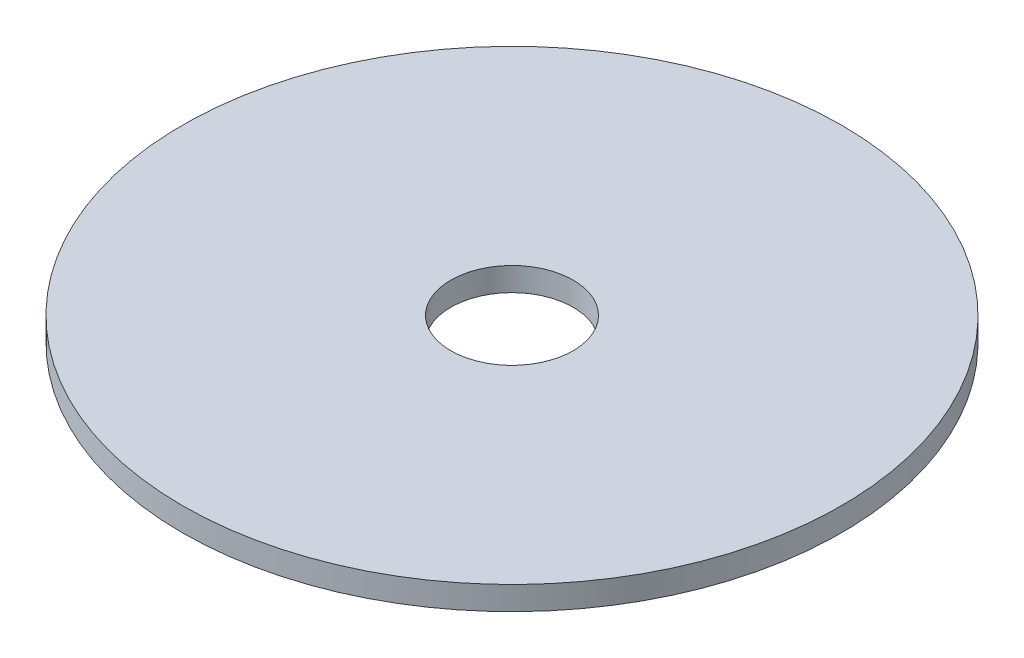
ISO-10303-21;
HEADER;
FILE_DESCRIPTION(('STEP AP214'),'2;1');
FILE_NAME('part.step','',(''),(''),'','','');
FILE_SCHEMA(('AUTOMOTIVE_DESIGN { 1 0 10303 214 1 1 1 1 }'));
ENDSEC;
DATA;
#1=APPLICATION_CONTEXT('core data for automotive mechanical design processes');
#2=APPLICATION_PROTOCOL_DEFINITION('international standard','automotive_design',2000,#1);
#3=PRODUCT_CONTEXT('',#1,'mechanical');
#4=PRODUCT('Part','Part','',(#3));
#5=PRODUCT_RELATED_PRODUCT_CATEGORY('part','',(#4));
#6=PRODUCT_DEFINITION_FORMATION('','',#4);
#7=PRODUCT_DEFINITION_CONTEXT('part definition',#1,'design');
#8=PRODUCT_DEFINITION('design','',#6,#7);
#9=PRODUCT_DEFINITION_SHAPE('','',#8);
#10=(LENGTH_UNIT() NAMED_UNIT(*) SI_UNIT(.MILLI.,.METRE.));
#11=(NAMED_UNIT(*) PLANE_ANGLE_UNIT() SI_UNIT($,.RADIAN.));
#12=(NAMED_UNIT(*) SI_UNIT($,.STERADIAN.) SOLID_ANGLE_UNIT());
#13=UNCERTAINTY_MEASURE_WITH_UNIT(LENGTH_MEASURE(1.E-05),#10,'distance_accuracy_value','');
#14=(GEOMETRIC_REPRESENTATION_CONTEXT(3) GLOBAL_UNCERTAINTY_ASSIGNED_CONTEXT((#13)) GLOBAL_UNIT_ASSIGNED_CONTEXT((#10,
#11,#12)) REPRESENTATION_CONTEXT('',''));
#15=CARTESIAN_POINT('',(0.,0.,0.));
#16=DIRECTION('',(0.,0.,1.));
#17=DIRECTION('',(1.,0.,0.));
#18=AXIS2_PLACEMENT_3D('',#15,#16,#17);
#19=CARTESIAN_POINT('',(0.,10.,0.));
#20=DIRECTION('',(0.,-1.,0.));
#21=DIRECTION('',(0.,0.,-1.));
#22=AXIS2_PLACEMENT_3D('',#19,#20,#21);
#23=CYLINDRICAL_SURFACE('',#22,140.);
#24=CARTESIAN_POINT('',(0.,10.,0.));
#25=DIRECTION('',(0.,1.,0.));
#26=DIRECTION('',(0.,0.,1.));
#27=AXIS2_PLACEMENT_3D('',#24,#25,#26);
#28=CIRCLE('',#27,140.);
#29=CARTESIAN_POINT('',(0.,10.,140.));
#30=VERTEX_POINT('',#29);
#31=EDGE_CURVE('E10',#30,#30,#28,.T.);
#32=ORIENTED_EDGE('',*,*,#31,.F.);
#33=EDGE_LOOP('',(#32));
#34=FACE_BOUND('',#33,.T.);
#35=CARTESIAN_POINT('',(0.,0.,0.));
#36=DIRECTION('',(0.,1.,0.));
#37=DIRECTION('',(0.,0.,1.));
#38=AXIS2_PLACEMENT_3D('',#35,#36,#37);
#39=CIRCLE('',#38,140.);
#40=CARTESIAN_POINT('',(0.,0.,140.));
#41=VERTEX_POINT('',#40);
#42=EDGE_CURVE('E35',#41,#41,#39,.T.);
#43=ORIENTED_EDGE('',*,*,#42,.T.);
#44=EDGE_LOOP('',(#43));
#45=FACE_BOUND('',#44,.T.);
#46=ADVANCED_FACE('F32',(#34,#45),#23,.T.);
#47=CARTESIAN_POINT('',(0.,10.,0.));
#48=DIRECTION('',(0.,1.,0.));
#49=DIRECTION('',(0.,0.,1.));
#50=AXIS2_PLACEMENT_3D('',#47,#48,#49);
#51=PLANE('',#50);
#52=CARTESIAN_POINT('',(0.,10.,0.));
#53=DIRECTION('',(0.,1.,0.));
#54=DIRECTION('',(0.,0.,1.));
#55=AXIS2_PLACEMENT_3D('',#52,#53,#54);
#56=CIRCLE('',#55,26.);
#57=CARTESIAN_POINT('',(0.,10.,26.));
#58=VERTEX_POINT('',#57);
#59=EDGE_CURVE('E44',#58,#58,#56,.T.);
#60=ORIENTED_EDGE('',*,*,#59,.F.);
#61=EDGE_LOOP('',(#60));
#62=FACE_BOUND('',#61,.T.);
#63=ORIENTED_EDGE('',*,*,#31,.T.);
#64=EDGE_LOOP('',(#63));
#65=FACE_BOUND('',#64,.T.);
#66=ADVANCED_FACE('F59',(#62,#65),#51,.T.);
#67=CARTESIAN_POINT('',(0.,0.,0.));
#68=DIRECTION('',(0.,1.,0.));
#69=DIRECTION('',(0.,0.,1.));
#70=AXIS2_PLACEMENT_3D('',#67,#68,#69);
#71=PLANE('',#70);
#72=CARTESIAN_POINT('',(0.,0.,0.));
#73=DIRECTION('',(0.,1.,0.));
#74=DIRECTION('',(0.,0.,1.));
#75=AXIS2_PLACEMENT_3D('',#72,#73,#74);
#76=CIRCLE('',#75,26.);
#77=CARTESIAN_POINT('',(0.,0.,26.));
#78=VERTEX_POINT('',#77);
#79=EDGE_CURVE('E42',#78,#78,#76,.T.);
#80=ORIENTED_EDGE('',*,*,#79,.T.);
#81=EDGE_LOOP('',(#80));
#82=FACE_BOUND('',#81,.T.);
#83=ORIENTED_EDGE('',*,*,#42,.F.);
#84=EDGE_LOOP('',(#83));
#85=FACE_BOUND('',#84,.T.);
#86=ADVANCED_FACE('F50',(#82,#85),#71,.F.);
#87=CARTESIAN_POINT('',(0.,0.,0.));
#88=DIRECTION('',(0.,1.,0.));
#89=DIRECTION('',(0.,0.,1.));
#90=AXIS2_PLACEMENT_3D('',#87,#88,#89);
#91=CYLINDRICAL_SURFACE('',#90,26.);
#92=ORIENTED_EDGE('',*,*,#79,.F.);
#93=EDGE_LOOP('',(#92));
#94=FACE_BOUND('',#93,.T.);
#95=ORIENTED_EDGE('',*,*,#59,.T.);
#96=EDGE_LOOP('',(#95));
#97=FACE_BOUND('',#96,.T.);
#98=ADVANCED_FACE('F53',(#94,#97),#91,.F.);
#99=CLOSED_SHELL('',(#46,#66,#86,#98));
#100=MANIFOLD_SOLID_BREP('B2',#99);
#101=ADVANCED_BREP_SHAPE_REPRESENTATION('',(#18,#100),#14);
#102=SHAPE_DEFINITION_REPRESENTATION(#9,#101);
ENDSEC;
END-ISO-10303-21;
